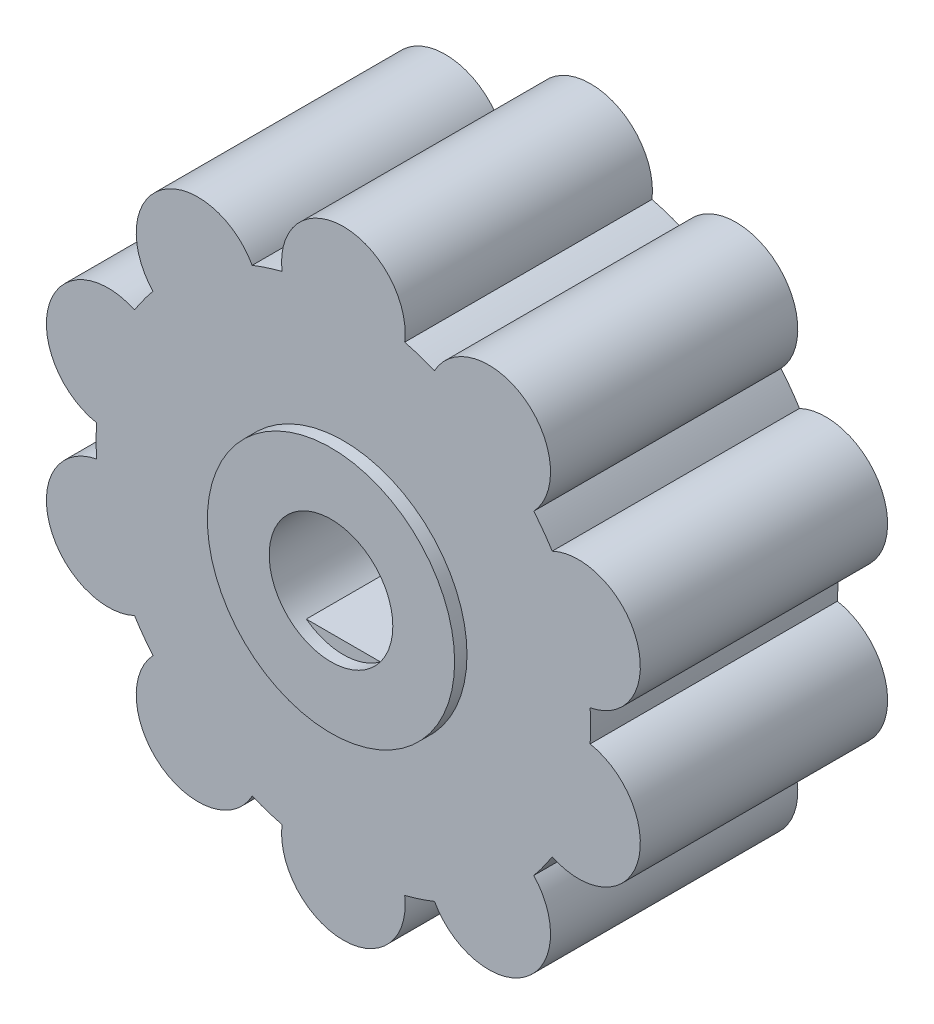
ISO-10303-21;
HEADER;
FILE_DESCRIPTION(('STEP AP214'),'2;1');
FILE_NAME('part.step','',(''),(''),'','','');
FILE_SCHEMA(('AUTOMOTIVE_DESIGN { 1 0 10303 214 1 1 1 1 }'));
ENDSEC;
DATA;
#1=APPLICATION_CONTEXT('core data for automotive mechanical design processes');
#2=APPLICATION_PROTOCOL_DEFINITION('international standard','automotive_design',2000,#1);
#3=PRODUCT_CONTEXT('',#1,'mechanical');
#4=PRODUCT('Part','Part','',(#3));
#5=PRODUCT_RELATED_PRODUCT_CATEGORY('part','',(#4));
#6=PRODUCT_DEFINITION_FORMATION('','',#4);
#7=PRODUCT_DEFINITION_CONTEXT('part definition',#1,'design');
#8=PRODUCT_DEFINITION('design','',#6,#7);
#9=PRODUCT_DEFINITION_SHAPE('','',#8);
#10=(LENGTH_UNIT() NAMED_UNIT(*) SI_UNIT(.MILLI.,.METRE.));
#11=(NAMED_UNIT(*) PLANE_ANGLE_UNIT() SI_UNIT($,.RADIAN.));
#12=(NAMED_UNIT(*) SI_UNIT($,.STERADIAN.) SOLID_ANGLE_UNIT());
#13=UNCERTAINTY_MEASURE_WITH_UNIT(LENGTH_MEASURE(1.E-05),#10,'distance_accuracy_value','');
#14=(GEOMETRIC_REPRESENTATION_CONTEXT(3) GLOBAL_UNCERTAINTY_ASSIGNED_CONTEXT((#13)) GLOBAL_UNIT_ASSIGNED_CONTEXT((#10,
#11,#12)) REPRESENTATION_CONTEXT('',''));
#15=CARTESIAN_POINT('',(0.,0.,0.));
#16=DIRECTION('',(0.,0.,1.));
#17=DIRECTION('',(1.,0.,0.));
#18=AXIS2_PLACEMENT_3D('',#15,#16,#17);
#19=CARTESIAN_POINT('',(0.,0.,10.5));
#20=DIRECTION('',(0.,0.,-1.));
#21=DIRECTION('',(-1.,0.,0.));
#22=AXIS2_PLACEMENT_3D('',#19,#20,#21);
#23=CYLINDRICAL_SURFACE('',#22,2.5);
#24=CARTESIAN_POINT('',(0.,0.,10.5));
#25=DIRECTION('',(0.,0.,1.));
#26=DIRECTION('',(1.,0.,0.));
#27=AXIS2_PLACEMENT_3D('',#24,#25,#26);
#28=CIRCLE('',#27,2.5);
#29=CARTESIAN_POINT('',(2.5,0.,10.5));
#30=VERTEX_POINT('',#29);
#31=EDGE_CURVE('E211',#30,#30,#28,.T.);
#32=ORIENTED_EDGE('',*,*,#31,.T.);
#33=EDGE_LOOP('',(#32));
#34=FACE_BOUND('',#33,.T.);
#35=CARTESIAN_POINT('',(0.,0.,-0.5));
#36=DIRECTION('',(0.,0.,1.));
#37=DIRECTION('',(1.,0.,0.));
#38=AXIS2_PLACEMENT_3D('',#35,#36,#37);
#39=CIRCLE('',#38,2.5);
#40=CARTESIAN_POINT('',(2.5,0.,-0.5));
#41=VERTEX_POINT('',#40);
#42=EDGE_CURVE('E215',#41,#41,#39,.F.);
#43=ORIENTED_EDGE('',*,*,#42,.T.);
#44=EDGE_LOOP('',(#43));
#45=FACE_BOUND('',#44,.T.);
#46=DIRECTION('',(0.,0.,1.));
#47=VECTOR('',#46,1.);
#48=CARTESIAN_POINT('',(-1.5,-2.,0.));
#49=LINE('',#48,#47);
#50=CARTESIAN_POINT('',(-1.5,-2.,0.));
#51=VERTEX_POINT('',#50);
#52=CARTESIAN_POINT('',(-1.5,-2.,10.));
#53=VERTEX_POINT('',#52);
#54=EDGE_CURVE('E64',#51,#53,#49,.T.);
#55=ORIENTED_EDGE('',*,*,#54,.F.);
#56=CARTESIAN_POINT('',(0.,0.,0.));
#57=DIRECTION('',(0.,0.,1.));
#58=DIRECTION('',(1.,0.,0.));
#59=AXIS2_PLACEMENT_3D('',#56,#57,#58);
#60=CIRCLE('',#59,2.5);
#61=CARTESIAN_POINT('',(1.5,-2.,0.));
#62=VERTEX_POINT('',#61);
#63=EDGE_CURVE('E12',#51,#62,#60,.T.);
#64=ORIENTED_EDGE('',*,*,#63,.T.);
#65=DIRECTION('',(0.,0.,-1.));
#66=VECTOR('',#65,1.);
#67=CARTESIAN_POINT('',(1.5,-2.,10.5));
#68=LINE('',#67,#66);
#69=CARTESIAN_POINT('',(1.5,-2.,10.));
#70=VERTEX_POINT('',#69);
#71=EDGE_CURVE('E54',#70,#62,#68,.T.);
#72=ORIENTED_EDGE('',*,*,#71,.F.);
#73=CARTESIAN_POINT('',(0.,0.,10.));
#74=DIRECTION('',(0.,0.,1.));
#75=DIRECTION('',(1.,0.,0.));
#76=AXIS2_PLACEMENT_3D('',#73,#74,#75);
#77=CIRCLE('',#76,2.5);
#78=EDGE_CURVE('E189',#53,#70,#77,.T.);
#79=ORIENTED_EDGE('',*,*,#78,.F.);
#80=EDGE_LOOP('',(#55,#64,#72,#79));
#81=FACE_BOUND('',#80,.T.);
#82=ADVANCED_FACE('F45',(#34,#45,#81),#23,.F.);
#83=CARTESIAN_POINT('',(0.,0.,10.));
#84=DIRECTION('',(0.,0.,-1.));
#85=DIRECTION('',(-1.,0.,0.));
#86=AXIS2_PLACEMENT_3D('',#83,#84,#85);
#87=CYLINDRICAL_SURFACE('',#86,10.);
#88=CARTESIAN_POINT('',(0.,0.,0.));
#89=DIRECTION('',(0.,0.,1.));
#90=DIRECTION('',(1.,0.,0.));
#91=AXIS2_PLACEMENT_3D('',#88,#89,#90);
#92=CIRCLE('',#91,10.);
#93=CARTESIAN_POINT('',(8.44687676597603,5.35259496883655,0.));
#94=VERTEX_POINT('',#93);
#95=CARTESIAN_POINT('',(7.70084879427799,6.37941438124749,0.));
#96=VERTEX_POINT('',#95);
#97=EDGE_CURVE('E398',#94,#96,#92,.T.);
#98=ORIENTED_EDGE('',*,*,#97,.T.);
#99=DIRECTION('',(0.,0.,-1.));
#100=VECTOR('',#99,1.);
#101=CARTESIAN_POINT('',(7.70084879427799,6.37941438124749,5.));
#102=LINE('',#101,#100);
#103=CARTESIAN_POINT('',(7.70084879427799,6.37941438124749,10.));
#104=VERTEX_POINT('',#103);
#105=EDGE_CURVE('E231',#96,#104,#102,.F.);
#106=ORIENTED_EDGE('',*,*,#105,.T.);
#107=CARTESIAN_POINT('',(0.,0.,10.));
#108=DIRECTION('',(0.,0.,1.));
#109=DIRECTION('',(1.,0.,0.));
#110=AXIS2_PLACEMENT_3D('',#107,#108,#109);
#111=CIRCLE('',#110,10.);
#112=CARTESIAN_POINT('',(8.44687676597603,5.35259496883655,10.));
#113=VERTEX_POINT('',#112);
#114=EDGE_CURVE('E473',#113,#104,#111,.T.);
#115=ORIENTED_EDGE('',*,*,#114,.F.);
#116=DIRECTION('',(0.,0.,-1.));
#117=VECTOR('',#116,1.);
#118=CARTESIAN_POINT('',(8.44687676597603,5.35259496883655,5.));
#119=LINE('',#118,#117);
#120=EDGE_CURVE('E239',#113,#94,#119,.T.);
#121=ORIENTED_EDGE('',*,*,#120,.T.);
#122=EDGE_LOOP('',(#98,#106,#115,#121));
#123=FACE_BOUND('',#122,.T.);
#124=ADVANCED_FACE('F492',(#123),#87,.T.);
#125=CARTESIAN_POINT('',(9.97984323724252,-0.634609297178059,0.));
#126=VERTEX_POINT('',#125);
#127=CARTESIAN_POINT('',(9.97984323724251,0.634609297178266,0.));
#128=VERTEX_POINT('',#127);
#129=EDGE_CURVE('E402',#126,#128,#92,.T.);
#130=ORIENTED_EDGE('',*,*,#129,.T.);
#131=DIRECTION('',(0.,0.,-1.));
#132=VECTOR('',#131,1.);
#133=CARTESIAN_POINT('',(9.97984323724251,0.634609297178269,5.));
#134=LINE('',#133,#132);
#135=CARTESIAN_POINT('',(9.97984323724251,0.634609297178266,10.));
#136=VERTEX_POINT('',#135);
#137=EDGE_CURVE('E246',#128,#136,#134,.F.);
#138=ORIENTED_EDGE('',*,*,#137,.T.);
#139=CARTESIAN_POINT('',(9.97984323724252,-0.634609297178057,10.));
#140=VERTEX_POINT('',#139);
#141=EDGE_CURVE('E469',#140,#136,#111,.T.);
#142=ORIENTED_EDGE('',*,*,#141,.F.);
#143=DIRECTION('',(0.,0.,-1.));
#144=VECTOR('',#143,1.);
#145=CARTESIAN_POINT('',(9.97984323724252,-0.634609297178059,5.));
#146=LINE('',#145,#144);
#147=EDGE_CURVE('E254',#140,#126,#146,.T.);
#148=ORIENTED_EDGE('',*,*,#147,.T.);
#149=EDGE_LOOP('',(#130,#138,#142,#148));
#150=FACE_BOUND('',#149,.T.);
#151=ADVANCED_FACE('F499',(#150),#87,.T.);
#152=CARTESIAN_POINT('',(7.70084879427813,-6.37941438124732,0.));
#153=VERTEX_POINT('',#152);
#154=CARTESIAN_POINT('',(8.44687676597614,-5.35259496883637,0.));
#155=VERTEX_POINT('',#154);
#156=EDGE_CURVE('E406',#153,#155,#92,.T.);
#157=ORIENTED_EDGE('',*,*,#156,.T.);
#158=DIRECTION('',(0.,0.,-1.));
#159=VECTOR('',#158,1.);
#160=CARTESIAN_POINT('',(8.44687676597614,-5.35259496883637,5.));
#161=LINE('',#160,#159);
#162=CARTESIAN_POINT('',(8.44687676597614,-5.35259496883637,10.));
#163=VERTEX_POINT('',#162);
#164=EDGE_CURVE('E261',#155,#163,#161,.F.);
#165=ORIENTED_EDGE('',*,*,#164,.T.);
#166=CARTESIAN_POINT('',(7.70084879427813,-6.37941438124732,10.));
#167=VERTEX_POINT('',#166);
#168=EDGE_CURVE('E465',#167,#163,#111,.T.);
#169=ORIENTED_EDGE('',*,*,#168,.F.);
#170=DIRECTION('',(0.,0.,-1.));
#171=VECTOR('',#170,1.);
#172=CARTESIAN_POINT('',(7.70084879427813,-6.37941438124732,5.));
#173=LINE('',#172,#171);
#174=EDGE_CURVE('E269',#167,#153,#173,.T.);
#175=ORIENTED_EDGE('',*,*,#174,.T.);
#176=EDGE_LOOP('',(#157,#165,#169,#175));
#177=FACE_BOUND('',#176,.T.);
#178=ADVANCED_FACE('F502',(#177),#87,.T.);
#179=CARTESIAN_POINT('',(2.48039185412305,-9.6875,0.));
#180=VERTEX_POINT('',#179);
#181=CARTESIAN_POINT('',(3.68749046888868,-9.29528988476719,0.));
#182=VERTEX_POINT('',#181);
#183=EDGE_CURVE('E410',#180,#182,#92,.T.);
#184=ORIENTED_EDGE('',*,*,#183,.T.);
#185=DIRECTION('',(0.,0.,-1.));
#186=VECTOR('',#185,1.);
#187=CARTESIAN_POINT('',(3.68749046888868,-9.29528988476719,5.));
#188=LINE('',#187,#186);
#189=CARTESIAN_POINT('',(3.68749046888868,-9.29528988476719,10.));
#190=VERTEX_POINT('',#189);
#191=EDGE_CURVE('E276',#182,#190,#188,.F.);
#192=ORIENTED_EDGE('',*,*,#191,.T.);
#193=CARTESIAN_POINT('',(2.48039185412306,-9.6875,10.));
#194=VERTEX_POINT('',#193);
#195=EDGE_CURVE('E461',#194,#190,#111,.T.);
#196=ORIENTED_EDGE('',*,*,#195,.F.);
#197=DIRECTION('',(0.,0.,-1.));
#198=VECTOR('',#197,1.);
#199=CARTESIAN_POINT('',(2.48039185412305,-9.6875,5.));
#200=LINE('',#199,#198);
#201=EDGE_CURVE('E284',#194,#180,#200,.T.);
#202=ORIENTED_EDGE('',*,*,#201,.T.);
#203=EDGE_LOOP('',(#184,#192,#196,#202));
#204=FACE_BOUND('',#203,.T.);
#205=ADVANCED_FACE('F509',(#204),#87,.T.);
#206=CARTESIAN_POINT('',(-3.68749046888855,-9.29528988476724,0.));
#207=VERTEX_POINT('',#206);
#208=CARTESIAN_POINT('',(-2.48039185412306,-9.6875,0.));
#209=VERTEX_POINT('',#208);
#210=EDGE_CURVE('E414',#207,#209,#92,.T.);
#211=ORIENTED_EDGE('',*,*,#210,.T.);
#212=DIRECTION('',(0.,0.,-1.));
#213=VECTOR('',#212,1.);
#214=CARTESIAN_POINT('',(-2.48039185412305,-9.6875,5.));
#215=LINE('',#214,#213);
#216=CARTESIAN_POINT('',(-2.48039185412306,-9.6875,10.));
#217=VERTEX_POINT('',#216);
#218=EDGE_CURVE('E291',#209,#217,#215,.F.);
#219=ORIENTED_EDGE('',*,*,#218,.T.);
#220=CARTESIAN_POINT('',(-3.68749046888854,-9.29528988476724,10.));
#221=VERTEX_POINT('',#220);
#222=EDGE_CURVE('E457',#221,#217,#111,.T.);
#223=ORIENTED_EDGE('',*,*,#222,.F.);
#224=DIRECTION('',(0.,0.,-1.));
#225=VECTOR('',#224,1.);
#226=CARTESIAN_POINT('',(-3.68749046888855,-9.29528988476724,5.));
#227=LINE('',#226,#225);
#228=EDGE_CURVE('E299',#221,#207,#227,.T.);
#229=ORIENTED_EDGE('',*,*,#228,.T.);
#230=EDGE_LOOP('',(#211,#219,#223,#229));
#231=FACE_BOUND('',#230,.T.);
#232=ADVANCED_FACE('F512',(#231),#87,.T.);
#233=CARTESIAN_POINT('',(-8.44687676597607,-5.35259496883649,0.));
#234=VERTEX_POINT('',#233);
#235=CARTESIAN_POINT('',(-7.70084879427804,-6.37941438124743,0.));
#236=VERTEX_POINT('',#235);
#237=EDGE_CURVE('E418',#234,#236,#92,.T.);
#238=ORIENTED_EDGE('',*,*,#237,.T.);
#239=DIRECTION('',(0.,0.,-1.));
#240=VECTOR('',#239,1.);
#241=CARTESIAN_POINT('',(-7.70084879427804,-6.37941438124743,5.));
#242=LINE('',#241,#240);
#243=CARTESIAN_POINT('',(-7.70084879427804,-6.37941438124743,10.));
#244=VERTEX_POINT('',#243);
#245=EDGE_CURVE('E306',#236,#244,#242,.F.);
#246=ORIENTED_EDGE('',*,*,#245,.T.);
#247=CARTESIAN_POINT('',(-8.44687676597607,-5.35259496883649,10.));
#248=VERTEX_POINT('',#247);
#249=EDGE_CURVE('E454',#248,#244,#111,.T.);
#250=ORIENTED_EDGE('',*,*,#249,.F.);
#251=DIRECTION('',(0.,0.,-1.));
#252=VECTOR('',#251,1.);
#253=CARTESIAN_POINT('',(-8.44687676597607,-5.35259496883649,5.));
#254=LINE('',#253,#252);
#255=EDGE_CURVE('E314',#248,#234,#254,.T.);
#256=ORIENTED_EDGE('',*,*,#255,.T.);
#257=EDGE_LOOP('',(#238,#246,#250,#256));
#258=FACE_BOUND('',#257,.T.);
#259=ADVANCED_FACE('F518',(#258),#87,.T.);
#260=CARTESIAN_POINT('',(-9.97984323724251,0.634609297178127,0.));
#261=VERTEX_POINT('',#260);
#262=CARTESIAN_POINT('',(-9.97984323724251,-0.634609297178196,0.));
#263=VERTEX_POINT('',#262);
#264=EDGE_CURVE('E422',#261,#263,#92,.T.);
#265=ORIENTED_EDGE('',*,*,#264,.T.);
#266=DIRECTION('',(0.,0.,-1.));
#267=VECTOR('',#266,1.);
#268=CARTESIAN_POINT('',(-9.97984323724251,-0.634609297178199,5.));
#269=LINE('',#268,#267);
#270=CARTESIAN_POINT('',(-9.97984323724251,-0.634609297178196,10.));
#271=VERTEX_POINT('',#270);
#272=EDGE_CURVE('E321',#263,#271,#269,.F.);
#273=ORIENTED_EDGE('',*,*,#272,.T.);
#274=CARTESIAN_POINT('',(-9.97984323724251,0.634609297178124,10.));
#275=VERTEX_POINT('',#274);
#276=EDGE_CURVE('E445',#275,#271,#111,.T.);
#277=ORIENTED_EDGE('',*,*,#276,.F.);
#278=DIRECTION('',(0.,0.,-1.));
#279=VECTOR('',#278,1.);
#280=CARTESIAN_POINT('',(-9.97984323724251,0.634609297178127,5.));
#281=LINE('',#280,#279);
#282=EDGE_CURVE('E329',#275,#261,#281,.T.);
#283=ORIENTED_EDGE('',*,*,#282,.T.);
#284=EDGE_LOOP('',(#265,#273,#277,#283));
#285=FACE_BOUND('',#284,.T.);
#286=ADVANCED_FACE('F443',(#285),#87,.T.);
#287=CARTESIAN_POINT('',(-7.70084879427808,6.37941438124738,0.));
#288=VERTEX_POINT('',#287);
#289=CARTESIAN_POINT('',(-8.44687676597611,5.35259496883643,0.));
#290=VERTEX_POINT('',#289);
#291=EDGE_CURVE('E391',#288,#290,#92,.T.);
#292=ORIENTED_EDGE('',*,*,#291,.T.);
#293=DIRECTION('',(0.,0.,-1.));
#294=VECTOR('',#293,1.);
#295=CARTESIAN_POINT('',(-8.44687676597611,5.35259496883643,5.));
#296=LINE('',#295,#294);
#297=CARTESIAN_POINT('',(-8.44687676597611,5.35259496883643,10.));
#298=VERTEX_POINT('',#297);
#299=EDGE_CURVE('E336',#290,#298,#296,.F.);
#300=ORIENTED_EDGE('',*,*,#299,.T.);
#301=CARTESIAN_POINT('',(-7.70084879427808,6.37941438124738,10.));
#302=VERTEX_POINT('',#301);
#303=EDGE_CURVE('E386',#302,#298,#111,.T.);
#304=ORIENTED_EDGE('',*,*,#303,.F.);
#305=DIRECTION('',(0.,0.,-1.));
#306=VECTOR('',#305,1.);
#307=CARTESIAN_POINT('',(-7.70084879427808,6.37941438124738,5.));
#308=LINE('',#307,#306);
#309=EDGE_CURVE('E344',#302,#288,#308,.T.);
#310=ORIENTED_EDGE('',*,*,#309,.T.);
#311=EDGE_LOOP('',(#292,#300,#304,#310));
#312=FACE_BOUND('',#311,.T.);
#313=ADVANCED_FACE('F431',(#312),#87,.T.);
#314=CARTESIAN_POINT('',(-2.48039185412305,9.6875,0.));
#315=VERTEX_POINT('',#314);
#316=CARTESIAN_POINT('',(-3.68749046888861,9.29528988476721,0.));
#317=VERTEX_POINT('',#316);
#318=EDGE_CURVE('E388',#315,#317,#92,.T.);
#319=ORIENTED_EDGE('',*,*,#318,.T.);
#320=DIRECTION('',(0.,0.,-1.));
#321=VECTOR('',#320,1.);
#322=CARTESIAN_POINT('',(-3.68749046888861,9.29528988476721,5.));
#323=LINE('',#322,#321);
#324=CARTESIAN_POINT('',(-3.68749046888861,9.29528988476721,10.));
#325=VERTEX_POINT('',#324);
#326=EDGE_CURVE('E351',#317,#325,#323,.F.);
#327=ORIENTED_EDGE('',*,*,#326,.T.);
#328=CARTESIAN_POINT('',(-2.48039185412306,9.6875,10.));
#329=VERTEX_POINT('',#328);
#330=EDGE_CURVE('E382',#329,#325,#111,.T.);
#331=ORIENTED_EDGE('',*,*,#330,.F.);
#332=DIRECTION('',(0.,0.,-1.));
#333=VECTOR('',#332,1.);
#334=CARTESIAN_POINT('',(-2.48039185412305,9.6875,5.));
#335=LINE('',#334,#333);
#336=EDGE_CURVE('E359',#329,#315,#335,.T.);
#337=ORIENTED_EDGE('',*,*,#336,.T.);
#338=EDGE_LOOP('',(#319,#327,#331,#337));
#339=FACE_BOUND('',#338,.T.);
#340=ADVANCED_FACE('F485',(#339),#87,.T.);
#341=CARTESIAN_POINT('',(3.68749046888847,9.29528988476727,10.));
#342=VERTEX_POINT('',#341);
#343=CARTESIAN_POINT('',(2.48039185412306,9.6875,10.));
#344=VERTEX_POINT('',#343);
#345=EDGE_CURVE('E387',#342,#344,#111,.T.);
#346=ORIENTED_EDGE('',*,*,#345,.F.);
#347=DIRECTION('',(0.,0.,-1.));
#348=VECTOR('',#347,1.);
#349=CARTESIAN_POINT('',(3.68749046888848,9.29528988476727,5.));
#350=LINE('',#349,#348);
#351=CARTESIAN_POINT('',(3.68749046888848,9.29528988476727,0.));
#352=VERTEX_POINT('',#351);
#353=EDGE_CURVE('E224',#342,#352,#350,.T.);
#354=ORIENTED_EDGE('',*,*,#353,.T.);
#355=CARTESIAN_POINT('',(2.48039185412306,9.6875,0.));
#356=VERTEX_POINT('',#355);
#357=EDGE_CURVE('E392',#352,#356,#92,.T.);
#358=ORIENTED_EDGE('',*,*,#357,.T.);
#359=DIRECTION('',(0.,0.,-1.));
#360=VECTOR('',#359,1.);
#361=CARTESIAN_POINT('',(2.48039185412305,9.6875,5.));
#362=LINE('',#361,#360);
#363=EDGE_CURVE('E366',#356,#344,#362,.F.);
#364=ORIENTED_EDGE('',*,*,#363,.T.);
#365=EDGE_LOOP('',(#346,#354,#358,#364));
#366=FACE_BOUND('',#365,.T.);
#367=ADVANCED_FACE('F47',(#366),#87,.T.);
#368=CARTESIAN_POINT('',(0.,0.,10.));
#369=DIRECTION('',(0.,0.,1.));
#370=DIRECTION('',(1.,0.,0.));
#371=AXIS2_PLACEMENT_3D('',#368,#369,#370);
#372=PLANE('',#371);
#373=ORIENTED_EDGE('',*,*,#114,.T.);
#374=CARTESIAN_POINT('',(5.87785252292463,8.09016994374955,10.));
#375=DIRECTION('',(0.,0.,-1.));
#376=DIRECTION('',(-0.809016994374955,0.587785252292462,0.));
#377=AXIS2_PLACEMENT_3D('',#374,#375,#376);
#378=CIRCLE('',#377,2.5);
#379=EDGE_CURVE('E220',#342,#104,#378,.T.);
#380=ORIENTED_EDGE('',*,*,#379,.F.);
#381=ORIENTED_EDGE('',*,*,#345,.T.);
#382=CARTESIAN_POINT('',(0.,10.,10.));
#383=DIRECTION('',(0.,0.,-1.));
#384=DIRECTION('',(-1.,0.,0.));
#385=AXIS2_PLACEMENT_3D('',#382,#383,#384);
#386=CIRCLE('',#385,2.5);
#387=EDGE_CURVE('E355',#329,#344,#386,.T.);
#388=ORIENTED_EDGE('',*,*,#387,.F.);
#389=ORIENTED_EDGE('',*,*,#330,.T.);
#390=CARTESIAN_POINT('',(-5.87785252292474,8.09016994374947,10.));
#391=DIRECTION('',(0.,0.,-1.));
#392=DIRECTION('',(-0.809016994374947,-0.587785252292474,0.));
#393=AXIS2_PLACEMENT_3D('',#390,#391,#392);
#394=CIRCLE('',#393,2.5);
#395=EDGE_CURVE('E340',#302,#325,#394,.T.);
#396=ORIENTED_EDGE('',*,*,#395,.F.);
#397=ORIENTED_EDGE('',*,*,#303,.T.);
#398=CARTESIAN_POINT('',(-9.51056516295155,3.09016994374945,10.));
#399=DIRECTION('',(0.,0.,-1.));
#400=DIRECTION('',(-0.309016994374945,-0.951056516295155,0.));
#401=AXIS2_PLACEMENT_3D('',#398,#399,#400);
#402=CIRCLE('',#401,2.5);
#403=EDGE_CURVE('E325',#275,#298,#402,.T.);
#404=ORIENTED_EDGE('',*,*,#403,.F.);
#405=ORIENTED_EDGE('',*,*,#276,.T.);
#406=CARTESIAN_POINT('',(-9.51056516295153,-3.09016994374952,10.));
#407=DIRECTION('',(0.,0.,-1.));
#408=DIRECTION('',(0.309016994374952,-0.951056516295152,0.));
#409=AXIS2_PLACEMENT_3D('',#406,#407,#408);
#410=CIRCLE('',#409,2.5);
#411=EDGE_CURVE('E310',#248,#271,#410,.T.);
#412=ORIENTED_EDGE('',*,*,#411,.F.);
#413=ORIENTED_EDGE('',*,*,#249,.T.);
#414=CARTESIAN_POINT('',(-5.87785252292469,-8.09016994374951,10.));
#415=DIRECTION('',(0.,0.,-1.));
#416=DIRECTION('',(0.809016994374951,-0.587785252292469,0.));
#417=AXIS2_PLACEMENT_3D('',#414,#415,#416);
#418=CIRCLE('',#417,2.5);
#419=EDGE_CURVE('E295',#221,#244,#418,.T.);
#420=ORIENTED_EDGE('',*,*,#419,.F.);
#421=ORIENTED_EDGE('',*,*,#222,.T.);
#422=CARTESIAN_POINT('',(0.,-10.,10.));
#423=DIRECTION('',(0.,0.,-1.));
#424=DIRECTION('',(1.,0.,0.));
#425=AXIS2_PLACEMENT_3D('',#422,#423,#424);
#426=CIRCLE('',#425,2.5);
#427=EDGE_CURVE('E280',#194,#217,#426,.T.);
#428=ORIENTED_EDGE('',*,*,#427,.F.);
#429=ORIENTED_EDGE('',*,*,#195,.T.);
#430=CARTESIAN_POINT('',(5.8778525229248,-8.09016994374942,10.));
#431=DIRECTION('',(0.,0.,-1.));
#432=DIRECTION('',(0.809016994374942,0.58778525229248,0.));
#433=AXIS2_PLACEMENT_3D('',#430,#431,#432);
#434=CIRCLE('',#433,2.5);
#435=EDGE_CURVE('E265',#167,#190,#434,.T.);
#436=ORIENTED_EDGE('',*,*,#435,.F.);
#437=ORIENTED_EDGE('',*,*,#168,.T.);
#438=CARTESIAN_POINT('',(9.51056516295157,-3.09016994374938,10.));
#439=DIRECTION('',(0.,0.,-1.));
#440=DIRECTION('',(0.309016994374938,0.951056516295157,0.));
#441=AXIS2_PLACEMENT_3D('',#438,#439,#440);
#442=CIRCLE('',#441,2.5);
#443=EDGE_CURVE('E250',#140,#163,#442,.T.);
#444=ORIENTED_EDGE('',*,*,#443,.F.);
#445=ORIENTED_EDGE('',*,*,#141,.T.);
#446=CARTESIAN_POINT('',(9.5105651629515,3.09016994374958,10.));
#447=DIRECTION('',(0.,0.,-1.));
#448=DIRECTION('',(-0.309016994374958,0.95105651629515,0.));
#449=AXIS2_PLACEMENT_3D('',#446,#447,#448);
#450=CIRCLE('',#449,2.5);
#451=EDGE_CURVE('E235',#113,#136,#450,.T.);
#452=ORIENTED_EDGE('',*,*,#451,.F.);
#453=EDGE_LOOP('',(#373,#380,#381,#388,#389,#396,#397,#404,#405,#412,#413,#420,#421,#428,#429,
#436,#437,#444,#445,#452));
#454=FACE_BOUND('',#453,.T.);
#455=CARTESIAN_POINT('',(0.,0.,10.));
#456=DIRECTION('',(0.,0.,1.));
#457=DIRECTION('',(1.,0.,0.));
#458=AXIS2_PLACEMENT_3D('',#455,#456,#457);
#459=CIRCLE('',#458,5.);
#460=CARTESIAN_POINT('',(5.,0.,10.));
#461=VERTEX_POINT('',#460);
#462=EDGE_CURVE('E200',#461,#461,#459,.T.);
#463=ORIENTED_EDGE('',*,*,#462,.F.);
#464=EDGE_LOOP('',(#463));
#465=FACE_BOUND('',#464,.T.);
#466=ADVANCED_FACE('F448',(#454,#465),#372,.T.);
#467=CARTESIAN_POINT('',(0.,0.,0.));
#468=DIRECTION('',(0.,0.,1.));
#469=DIRECTION('',(1.,0.,0.));
#470=AXIS2_PLACEMENT_3D('',#467,#468,#469);
#471=PLANE('',#470);
#472=CARTESIAN_POINT('',(0.,0.,0.));
#473=DIRECTION('',(0.,0.,1.));
#474=DIRECTION('',(1.,0.,0.));
#475=AXIS2_PLACEMENT_3D('',#472,#473,#474);
#476=CIRCLE('',#475,5.);
#477=CARTESIAN_POINT('',(5.,0.,0.));
#478=VERTEX_POINT('',#477);
#479=EDGE_CURVE('E378',#478,#478,#476,.T.);
#480=ORIENTED_EDGE('',*,*,#479,.T.);
#481=EDGE_LOOP('',(#480));
#482=FACE_BOUND('',#481,.T.);
#483=ORIENTED_EDGE('',*,*,#357,.F.);
#484=CARTESIAN_POINT('',(5.87785252292463,8.09016994374955,0.));
#485=DIRECTION('',(0.,0.,-1.));
#486=DIRECTION('',(-0.809016994374955,0.587785252292462,0.));
#487=AXIS2_PLACEMENT_3D('',#484,#485,#486);
#488=CIRCLE('',#487,2.5);
#489=EDGE_CURVE('E219',#352,#96,#488,.T.);
#490=ORIENTED_EDGE('',*,*,#489,.T.);
#491=ORIENTED_EDGE('',*,*,#97,.F.);
#492=CARTESIAN_POINT('',(9.5105651629515,3.09016994374958,0.));
#493=DIRECTION('',(0.,0.,-1.));
#494=DIRECTION('',(-0.309016994374958,0.95105651629515,0.));
#495=AXIS2_PLACEMENT_3D('',#492,#493,#494);
#496=CIRCLE('',#495,2.5);
#497=EDGE_CURVE('E234',#94,#128,#496,.T.);
#498=ORIENTED_EDGE('',*,*,#497,.T.);
#499=ORIENTED_EDGE('',*,*,#129,.F.);
#500=CARTESIAN_POINT('',(9.51056516295157,-3.09016994374938,0.));
#501=DIRECTION('',(0.,0.,-1.));
#502=DIRECTION('',(0.309016994374938,0.951056516295157,0.));
#503=AXIS2_PLACEMENT_3D('',#500,#501,#502);
#504=CIRCLE('',#503,2.5);
#505=EDGE_CURVE('E249',#126,#155,#504,.T.);
#506=ORIENTED_EDGE('',*,*,#505,.T.);
#507=ORIENTED_EDGE('',*,*,#156,.F.);
#508=CARTESIAN_POINT('',(5.8778525229248,-8.09016994374942,0.));
#509=DIRECTION('',(0.,0.,-1.));
#510=DIRECTION('',(0.809016994374942,0.58778525229248,0.));
#511=AXIS2_PLACEMENT_3D('',#508,#509,#510);
#512=CIRCLE('',#511,2.5);
#513=EDGE_CURVE('E264',#153,#182,#512,.T.);
#514=ORIENTED_EDGE('',*,*,#513,.T.);
#515=ORIENTED_EDGE('',*,*,#183,.F.);
#516=CARTESIAN_POINT('',(0.,-10.,0.));
#517=DIRECTION('',(0.,0.,-1.));
#518=DIRECTION('',(1.,0.,0.));
#519=AXIS2_PLACEMENT_3D('',#516,#517,#518);
#520=CIRCLE('',#519,2.5);
#521=EDGE_CURVE('E279',#180,#209,#520,.T.);
#522=ORIENTED_EDGE('',*,*,#521,.T.);
#523=ORIENTED_EDGE('',*,*,#210,.F.);
#524=CARTESIAN_POINT('',(-5.87785252292469,-8.09016994374951,0.));
#525=DIRECTION('',(0.,0.,-1.));
#526=DIRECTION('',(0.809016994374951,-0.587785252292469,0.));
#527=AXIS2_PLACEMENT_3D('',#524,#525,#526);
#528=CIRCLE('',#527,2.5);
#529=EDGE_CURVE('E294',#207,#236,#528,.T.);
#530=ORIENTED_EDGE('',*,*,#529,.T.);
#531=ORIENTED_EDGE('',*,*,#237,.F.);
#532=CARTESIAN_POINT('',(-9.51056516295153,-3.09016994374952,0.));
#533=DIRECTION('',(0.,0.,-1.));
#534=DIRECTION('',(0.309016994374952,-0.951056516295152,0.));
#535=AXIS2_PLACEMENT_3D('',#532,#533,#534);
#536=CIRCLE('',#535,2.5);
#537=EDGE_CURVE('E309',#234,#263,#536,.T.);
#538=ORIENTED_EDGE('',*,*,#537,.T.);
#539=ORIENTED_EDGE('',*,*,#264,.F.);
#540=CARTESIAN_POINT('',(-9.51056516295155,3.09016994374945,0.));
#541=DIRECTION('',(0.,0.,-1.));
#542=DIRECTION('',(-0.309016994374945,-0.951056516295155,0.));
#543=AXIS2_PLACEMENT_3D('',#540,#541,#542);
#544=CIRCLE('',#543,2.5);
#545=EDGE_CURVE('E324',#261,#290,#544,.T.);
#546=ORIENTED_EDGE('',*,*,#545,.T.);
#547=ORIENTED_EDGE('',*,*,#291,.F.);
#548=CARTESIAN_POINT('',(-5.87785252292474,8.09016994374947,0.));
#549=DIRECTION('',(0.,0.,-1.));
#550=DIRECTION('',(-0.809016994374947,-0.587785252292474,0.));
#551=AXIS2_PLACEMENT_3D('',#548,#549,#550);
#552=CIRCLE('',#551,2.5);
#553=EDGE_CURVE('E339',#288,#317,#552,.T.);
#554=ORIENTED_EDGE('',*,*,#553,.T.);
#555=ORIENTED_EDGE('',*,*,#318,.F.);
#556=CARTESIAN_POINT('',(0.,10.,0.));
#557=DIRECTION('',(0.,0.,-1.));
#558=DIRECTION('',(-1.,0.,0.));
#559=AXIS2_PLACEMENT_3D('',#556,#557,#558);
#560=CIRCLE('',#559,2.5);
#561=EDGE_CURVE('E354',#315,#356,#560,.T.);
#562=ORIENTED_EDGE('',*,*,#561,.T.);
#563=EDGE_LOOP('',(#483,#490,#491,#498,#499,#506,#507,#514,#515,#522,#523,#530,#531,#538,#539,
#546,#547,#554,#555,#562));
#564=FACE_BOUND('',#563,.T.);
#565=ADVANCED_FACE('F441',(#482,#564),#471,.F.);
#566=CARTESIAN_POINT('',(0.,0.,-0.5));
#567=DIRECTION('',(0.,0.,1.));
#568=DIRECTION('',(1.,0.,0.));
#569=AXIS2_PLACEMENT_3D('',#566,#567,#568);
#570=PLANE('',#569);
#571=ORIENTED_EDGE('',*,*,#42,.F.);
#572=EDGE_LOOP('',(#571));
#573=FACE_BOUND('',#572,.T.);
#574=CARTESIAN_POINT('',(0.,0.,-0.5));
#575=DIRECTION('',(0.,0.,1.));
#576=DIRECTION('',(1.,0.,0.));
#577=AXIS2_PLACEMENT_3D('',#574,#575,#576);
#578=CIRCLE('',#577,5.);
#579=CARTESIAN_POINT('',(5.,0.,-0.500000000000001));
#580=VERTEX_POINT('',#579);
#581=EDGE_CURVE('E374',#580,#580,#578,.T.);
#582=ORIENTED_EDGE('',*,*,#581,.F.);
#583=EDGE_LOOP('',(#582));
#584=FACE_BOUND('',#583,.T.);
#585=ADVANCED_FACE('F661',(#573,#584),#570,.F.);
#586=CARTESIAN_POINT('',(0.,0.,-0.5));
#587=DIRECTION('',(0.,0.,1.));
#588=DIRECTION('',(1.,0.,0.));
#589=AXIS2_PLACEMENT_3D('',#586,#587,#588);
#590=CYLINDRICAL_SURFACE('',#589,5.);
#591=CARTESIAN_POINT('',(5.,0.,-0.500000000000001));
#592=CARTESIAN_POINT('',(5.,0.,-0.494791666666667));
#593=CARTESIAN_POINT('',(5.,0.,-0.489583333333334));
#594=CARTESIAN_POINT('',(5.,0.,-0.479166666666667));
#595=CARTESIAN_POINT('',(5.,0.,-0.473958333333334));
#596=CARTESIAN_POINT('',(5.,0.,-0.463541666666667));
#597=CARTESIAN_POINT('',(5.,0.,-0.458333333333334));
#598=CARTESIAN_POINT('',(5.,0.,-0.447916666666667));
#599=CARTESIAN_POINT('',(5.,0.,-0.442708333333334));
#600=CARTESIAN_POINT('',(5.,0.,-0.432291666666667));
#601=CARTESIAN_POINT('',(5.,0.,-0.427083333333334));
#602=CARTESIAN_POINT('',(5.,0.,-0.416666666666667));
#603=CARTESIAN_POINT('',(5.,0.,-0.411458333333334));
#604=CARTESIAN_POINT('',(5.,0.,-0.401041666666667));
#605=CARTESIAN_POINT('',(5.,0.,-0.395833333333334));
#606=CARTESIAN_POINT('',(5.,0.,-0.385416666666667));
#607=CARTESIAN_POINT('',(5.,0.,-0.380208333333334));
#608=CARTESIAN_POINT('',(5.,0.,-0.369791666666667));
#609=CARTESIAN_POINT('',(5.,0.,-0.364583333333334));
#610=CARTESIAN_POINT('',(5.,0.,-0.354166666666667));
#611=CARTESIAN_POINT('',(5.,0.,-0.348958333333334));
#612=CARTESIAN_POINT('',(5.,0.,-0.338541666666667));
#613=CARTESIAN_POINT('',(5.,0.,-0.333333333333334));
#614=CARTESIAN_POINT('',(5.,0.,-0.322916666666667));
#615=CARTESIAN_POINT('',(5.,0.,-0.317708333333334));
#616=CARTESIAN_POINT('',(5.,0.,-0.307291666666667));
#617=CARTESIAN_POINT('',(5.,0.,-0.302083333333334));
#618=CARTESIAN_POINT('',(5.,0.,-0.291666666666667));
#619=CARTESIAN_POINT('',(5.,0.,-0.286458333333334));
#620=CARTESIAN_POINT('',(5.,0.,-0.276041666666667));
#621=CARTESIAN_POINT('',(5.,0.,-0.270833333333334));
#622=CARTESIAN_POINT('',(5.,0.,-0.260416666666667));
#623=CARTESIAN_POINT('',(5.,0.,-0.255208333333334));
#624=CARTESIAN_POINT('',(5.,0.,-0.244791666666667));
#625=CARTESIAN_POINT('',(5.,0.,-0.239583333333334));
#626=CARTESIAN_POINT('',(5.,0.,-0.229166666666667));
#627=CARTESIAN_POINT('',(5.,0.,-0.223958333333334));
#628=CARTESIAN_POINT('',(5.,0.,-0.213541666666667));
#629=CARTESIAN_POINT('',(5.,0.,-0.208333333333334));
#630=CARTESIAN_POINT('',(5.,0.,-0.197916666666667));
#631=CARTESIAN_POINT('',(5.,0.,-0.192708333333334));
#632=CARTESIAN_POINT('',(5.,0.,-0.182291666666667));
#633=CARTESIAN_POINT('',(5.,0.,-0.177083333333334));
#634=CARTESIAN_POINT('',(5.,0.,-0.166666666666667));
#635=CARTESIAN_POINT('',(5.,0.,-0.161458333333334));
#636=CARTESIAN_POINT('',(5.,0.,-0.151041666666667));
#637=CARTESIAN_POINT('',(5.,0.,-0.145833333333334));
#638=CARTESIAN_POINT('',(5.,0.,-0.135416666666667));
#639=CARTESIAN_POINT('',(5.,0.,-0.130208333333333));
#640=CARTESIAN_POINT('',(5.,0.,-0.119791666666667));
#641=CARTESIAN_POINT('',(5.,0.,-0.114583333333333));
#642=CARTESIAN_POINT('',(5.,0.,-0.104166666666667));
#643=CARTESIAN_POINT('',(5.,0.,-0.0989583333333334));
#644=CARTESIAN_POINT('',(5.,0.,-0.0885416666666667));
#645=CARTESIAN_POINT('',(5.,0.,-0.0833333333333334));
#646=CARTESIAN_POINT('',(5.,0.,-0.0729166666666667));
#647=CARTESIAN_POINT('',(5.,0.,-0.0677083333333334));
#648=CARTESIAN_POINT('',(5.,0.,-0.0572916666666667));
#649=CARTESIAN_POINT('',(5.,0.,-0.0520833333333334));
#650=CARTESIAN_POINT('',(5.,0.,-0.0416666666666667));
#651=CARTESIAN_POINT('',(5.,0.,-0.0364583333333334));
#652=CARTESIAN_POINT('',(5.,0.,-0.0260416666666667));
#653=CARTESIAN_POINT('',(5.,0.,-0.0208333333333333));
#654=CARTESIAN_POINT('',(5.,0.,-0.0104166666666667));
#655=CARTESIAN_POINT('',(5.,0.,-0.00520833333333341));
#656=CARTESIAN_POINT('',(5.,0.,0.));
#657=B_SPLINE_CURVE_WITH_KNOTS('',3,(#591,#592,#593,#594,#595,#596,#597,#598,#599,#600,#601,
#602,#603,#604,#605,#606,#607,#608,#609,#610,#611,#612,#613,#614,#615,#616,#617,#618,#619,#620,
#621,#622,#623,#624,#625,#626,#627,#628,#629,#630,#631,#632,#633,#634,#635,#636,#637,#638,#639,
#640,#641,#642,#643,#644,#645,#646,#647,#648,#649,#650,#651,#652,#653,#654,#655,#656),
.UNSPECIFIED.,.F.,.F.,(4,2,2,2,2,2,2,2,2,2,2,2,2,2,2,2,2,2,2,2,2,2,2,2,2,2,2,2,2,2,2,2,4),(0.,
0.0156250000000001,0.0312500000000001,0.0468750000000001,0.0625000000000001,0.0781250000000001,
0.0937500000000001,0.109375,0.125,0.140625,0.15625,0.171875,0.1875,0.203125,0.21875,0.234375,
0.25,0.265625,0.28125,0.296875,0.3125,0.328125,0.34375,0.359375,0.375,0.390625,0.40625,0.421875,
0.4375,0.453125,0.46875,0.484375000000001,0.5),.UNSPECIFIED.);
#658=EDGE_CURVE('BSEAM766',#580,#478,#657,.T.);
#659=ORIENTED_EDGE('',*,*,#581,.T.);
#660=ORIENTED_EDGE('',*,*,#479,.F.);
#661=ORIENTED_EDGE('',*,*,#658,.T.);
#662=ORIENTED_EDGE('',*,*,#658,.F.);
#663=EDGE_LOOP('',(#659,#661,#660,#662));
#664=FACE_BOUND('',#663,.T.);
#665=ADVANCED_FACE('F766',(#664),#590,.T.);
#666=CARTESIAN_POINT('',(0.,0.,10.5));
#667=DIRECTION('',(0.,0.,1.));
#668=DIRECTION('',(1.,0.,0.));
#669=AXIS2_PLACEMENT_3D('',#666,#667,#668);
#670=CIRCLE('',#669,5.);
#671=CARTESIAN_POINT('',(5.,0.,10.5));
#672=VERTEX_POINT('',#671);
#673=EDGE_CURVE('E370',#672,#672,#670,.T.);
#674=CARTESIAN_POINT('',(5.,0.,10.));
#675=CARTESIAN_POINT('',(5.,0.,10.0052083333333));
#676=CARTESIAN_POINT('',(5.,0.,10.0104166666667));
#677=CARTESIAN_POINT('',(5.,0.,10.0208333333333));
#678=CARTESIAN_POINT('',(5.,0.,10.0260416666667));
#679=CARTESIAN_POINT('',(5.,0.,10.0364583333333));
#680=CARTESIAN_POINT('',(5.,0.,10.0416666666667));
#681=CARTESIAN_POINT('',(5.,0.,10.0520833333333));
#682=CARTESIAN_POINT('',(5.,0.,10.0572916666667));
#683=CARTESIAN_POINT('',(5.,0.,10.0677083333333));
#684=CARTESIAN_POINT('',(5.,0.,10.0729166666667));
#685=CARTESIAN_POINT('',(5.,0.,10.0833333333333));
#686=CARTESIAN_POINT('',(5.,0.,10.0885416666667));
#687=CARTESIAN_POINT('',(5.,0.,10.0989583333333));
#688=CARTESIAN_POINT('',(5.,0.,10.1041666666667));
#689=CARTESIAN_POINT('',(5.,0.,10.1145833333333));
#690=CARTESIAN_POINT('',(5.,0.,10.1197916666667));
#691=CARTESIAN_POINT('',(5.,0.,10.1302083333333));
#692=CARTESIAN_POINT('',(5.,0.,10.1354166666667));
#693=CARTESIAN_POINT('',(5.,0.,10.1458333333333));
#694=CARTESIAN_POINT('',(5.,0.,10.1510416666667));
#695=CARTESIAN_POINT('',(5.,0.,10.1614583333333));
#696=CARTESIAN_POINT('',(5.,0.,10.1666666666667));
#697=CARTESIAN_POINT('',(5.,0.,10.1770833333333));
#698=CARTESIAN_POINT('',(5.,0.,10.1822916666667));
#699=CARTESIAN_POINT('',(5.,0.,10.1927083333333));
#700=CARTESIAN_POINT('',(5.,0.,10.1979166666667));
#701=CARTESIAN_POINT('',(5.,0.,10.2083333333333));
#702=CARTESIAN_POINT('',(5.,0.,10.2135416666667));
#703=CARTESIAN_POINT('',(5.,0.,10.2239583333333));
#704=CARTESIAN_POINT('',(5.,0.,10.2291666666667));
#705=CARTESIAN_POINT('',(5.,0.,10.2395833333333));
#706=CARTESIAN_POINT('',(5.,0.,10.2447916666667));
#707=CARTESIAN_POINT('',(5.,0.,10.2552083333333));
#708=CARTESIAN_POINT('',(5.,0.,10.2604166666667));
#709=CARTESIAN_POINT('',(5.,0.,10.2708333333333));
#710=CARTESIAN_POINT('',(5.,0.,10.2760416666667));
#711=CARTESIAN_POINT('',(5.,0.,10.2864583333333));
#712=CARTESIAN_POINT('',(5.,0.,10.2916666666667));
#713=CARTESIAN_POINT('',(5.,0.,10.3020833333333));
#714=CARTESIAN_POINT('',(5.,0.,10.3072916666667));
#715=CARTESIAN_POINT('',(5.,0.,10.3177083333333));
#716=CARTESIAN_POINT('',(5.,0.,10.3229166666667));
#717=CARTESIAN_POINT('',(5.,0.,10.3333333333333));
#718=CARTESIAN_POINT('',(5.,0.,10.3385416666667));
#719=CARTESIAN_POINT('',(5.,0.,10.3489583333333));
#720=CARTESIAN_POINT('',(5.,0.,10.3541666666667));
#721=CARTESIAN_POINT('',(5.,0.,10.3645833333333));
#722=CARTESIAN_POINT('',(5.,0.,10.3697916666667));
#723=CARTESIAN_POINT('',(5.,0.,10.3802083333333));
#724=CARTESIAN_POINT('',(5.,0.,10.3854166666667));
#725=CARTESIAN_POINT('',(5.,0.,10.3958333333333));
#726=CARTESIAN_POINT('',(5.,0.,10.4010416666667));
#727=CARTESIAN_POINT('',(5.,0.,10.4114583333333));
#728=CARTESIAN_POINT('',(5.,0.,10.4166666666667));
#729=CARTESIAN_POINT('',(5.,0.,10.4270833333333));
#730=CARTESIAN_POINT('',(5.,0.,10.4322916666667));
#731=CARTESIAN_POINT('',(5.,0.,10.4427083333333));
#732=CARTESIAN_POINT('',(5.,0.,10.4479166666667));
#733=CARTESIAN_POINT('',(5.,0.,10.4583333333333));
#734=CARTESIAN_POINT('',(5.,0.,10.4635416666667));
#735=CARTESIAN_POINT('',(5.,0.,10.4739583333333));
#736=CARTESIAN_POINT('',(5.,0.,10.4791666666667));
#737=CARTESIAN_POINT('',(5.,0.,10.4895833333333));
#738=CARTESIAN_POINT('',(5.,0.,10.4947916666667));
#739=CARTESIAN_POINT('',(5.,0.,10.5));
#740=B_SPLINE_CURVE_WITH_KNOTS('',3,(#674,#675,#676,#677,#678,#679,#680,#681,#682,#683,#684,
#685,#686,#687,#688,#689,#690,#691,#692,#693,#694,#695,#696,#697,#698,#699,#700,#701,#702,#703,
#704,#705,#706,#707,#708,#709,#710,#711,#712,#713,#714,#715,#716,#717,#718,#719,#720,#721,#722,
#723,#724,#725,#726,#727,#728,#729,#730,#731,#732,#733,#734,#735,#736,#737,#738,#739),
.UNSPECIFIED.,.F.,.F.,(4,2,2,2,2,2,2,2,2,2,2,2,2,2,2,2,2,2,2,2,2,2,2,2,2,2,2,2,2,2,2,2,4),(0.,
0.015625,0.03125,0.046875,0.0625000000000001,0.0781250000000001,0.0937500000000001,0.109375,
0.125,0.140625,0.15625,0.171875,0.1875,0.203125,0.21875,0.234375,0.25,0.265625,0.28125,0.296875,
0.3125,0.328125,0.34375,0.359375,0.375,0.390625,0.40625,0.421875,0.4375,0.453125,0.46875,
0.484375,0.5),.UNSPECIFIED.);
#741=EDGE_CURVE('BSEAM761',#461,#672,#740,.T.);
#742=ORIENTED_EDGE('',*,*,#462,.T.);
#743=ORIENTED_EDGE('',*,*,#673,.F.);
#744=ORIENTED_EDGE('',*,*,#741,.T.);
#745=ORIENTED_EDGE('',*,*,#741,.F.);
#746=EDGE_LOOP('',(#742,#744,#743,#745));
#747=FACE_BOUND('',#746,.T.);
#748=ADVANCED_FACE('F761',(#747),#590,.T.);
#749=CARTESIAN_POINT('',(0.,0.,10.5));
#750=DIRECTION('',(0.,0.,1.));
#751=DIRECTION('',(1.,0.,0.));
#752=AXIS2_PLACEMENT_3D('',#749,#750,#751);
#753=PLANE('',#752);
#754=ORIENTED_EDGE('',*,*,#31,.F.);
#755=EDGE_LOOP('',(#754));
#756=FACE_BOUND('',#755,.T.);
#757=ORIENTED_EDGE('',*,*,#673,.T.);
#758=EDGE_LOOP('',(#757));
#759=FACE_BOUND('',#758,.T.);
#760=ADVANCED_FACE('F754',(#756,#759),#753,.T.);
#761=CARTESIAN_POINT('',(0.,10.,10.));
#762=DIRECTION('',(0.,0.,-1.));
#763=DIRECTION('',(-1.,0.,0.));
#764=AXIS2_PLACEMENT_3D('',#761,#762,#763);
#765=CYLINDRICAL_SURFACE('',#764,2.5);
#766=ORIENTED_EDGE('',*,*,#363,.F.);
#767=ORIENTED_EDGE('',*,*,#561,.F.);
#768=ORIENTED_EDGE('',*,*,#336,.F.);
#769=ORIENTED_EDGE('',*,*,#387,.T.);
#770=EDGE_LOOP('',(#766,#767,#768,#769));
#771=FACE_BOUND('',#770,.T.);
#772=ADVANCED_FACE('F483',(#771),#765,.T.);
#773=CARTESIAN_POINT('',(-5.87785252292474,8.09016994374947,10.));
#774=DIRECTION('',(0.,0.,-1.));
#775=DIRECTION('',(-1.,0.,0.));
#776=AXIS2_PLACEMENT_3D('',#773,#774,#775);
#777=CYLINDRICAL_SURFACE('',#776,2.5);
#778=ORIENTED_EDGE('',*,*,#326,.F.);
#779=ORIENTED_EDGE('',*,*,#553,.F.);
#780=ORIENTED_EDGE('',*,*,#309,.F.);
#781=ORIENTED_EDGE('',*,*,#395,.T.);
#782=EDGE_LOOP('',(#778,#779,#780,#781));
#783=FACE_BOUND('',#782,.T.);
#784=ADVANCED_FACE('F488',(#783),#777,.T.);
#785=CARTESIAN_POINT('',(-9.51056516295155,3.09016994374945,10.));
#786=DIRECTION('',(0.,0.,-1.));
#787=DIRECTION('',(-1.,0.,0.));
#788=AXIS2_PLACEMENT_3D('',#785,#786,#787);
#789=CYLINDRICAL_SURFACE('',#788,2.5);
#790=ORIENTED_EDGE('',*,*,#299,.F.);
#791=ORIENTED_EDGE('',*,*,#545,.F.);
#792=ORIENTED_EDGE('',*,*,#282,.F.);
#793=ORIENTED_EDGE('',*,*,#403,.T.);
#794=EDGE_LOOP('',(#790,#791,#792,#793));
#795=FACE_BOUND('',#794,.T.);
#796=ADVANCED_FACE('F438',(#795),#789,.T.);
#797=CARTESIAN_POINT('',(-9.51056516295153,-3.09016994374952,10.));
#798=DIRECTION('',(0.,0.,-1.));
#799=DIRECTION('',(-1.,0.,0.));
#800=AXIS2_PLACEMENT_3D('',#797,#798,#799);
#801=CYLINDRICAL_SURFACE('',#800,2.5);
#802=ORIENTED_EDGE('',*,*,#272,.F.);
#803=ORIENTED_EDGE('',*,*,#537,.F.);
#804=ORIENTED_EDGE('',*,*,#255,.F.);
#805=ORIENTED_EDGE('',*,*,#411,.T.);
#806=EDGE_LOOP('',(#802,#803,#804,#805));
#807=FACE_BOUND('',#806,.T.);
#808=ADVANCED_FACE('F520',(#807),#801,.T.);
#809=CARTESIAN_POINT('',(-5.87785252292469,-8.09016994374951,10.));
#810=DIRECTION('',(0.,0.,-1.));
#811=DIRECTION('',(-1.,0.,0.));
#812=AXIS2_PLACEMENT_3D('',#809,#810,#811);
#813=CYLINDRICAL_SURFACE('',#812,2.5);
#814=ORIENTED_EDGE('',*,*,#245,.F.);
#815=ORIENTED_EDGE('',*,*,#529,.F.);
#816=ORIENTED_EDGE('',*,*,#228,.F.);
#817=ORIENTED_EDGE('',*,*,#419,.T.);
#818=EDGE_LOOP('',(#814,#815,#816,#817));
#819=FACE_BOUND('',#818,.T.);
#820=ADVANCED_FACE('F516',(#819),#813,.T.);
#821=CARTESIAN_POINT('',(0.,-10.,10.));
#822=DIRECTION('',(0.,0.,-1.));
#823=DIRECTION('',(-1.,0.,0.));
#824=AXIS2_PLACEMENT_3D('',#821,#822,#823);
#825=CYLINDRICAL_SURFACE('',#824,2.5);
#826=ORIENTED_EDGE('',*,*,#218,.F.);
#827=ORIENTED_EDGE('',*,*,#521,.F.);
#828=ORIENTED_EDGE('',*,*,#201,.F.);
#829=ORIENTED_EDGE('',*,*,#427,.T.);
#830=EDGE_LOOP('',(#826,#827,#828,#829));
#831=FACE_BOUND('',#830,.T.);
#832=ADVANCED_FACE('F511',(#831),#825,.T.);
#833=CARTESIAN_POINT('',(5.8778525229248,-8.09016994374942,10.));
#834=DIRECTION('',(0.,0.,-1.));
#835=DIRECTION('',(-1.,0.,0.));
#836=AXIS2_PLACEMENT_3D('',#833,#834,#835);
#837=CYLINDRICAL_SURFACE('',#836,2.5);
#838=ORIENTED_EDGE('',*,*,#191,.F.);
#839=ORIENTED_EDGE('',*,*,#513,.F.);
#840=ORIENTED_EDGE('',*,*,#174,.F.);
#841=ORIENTED_EDGE('',*,*,#435,.T.);
#842=EDGE_LOOP('',(#838,#839,#840,#841));
#843=FACE_BOUND('',#842,.T.);
#844=ADVANCED_FACE('F506',(#843),#837,.T.);
#845=CARTESIAN_POINT('',(9.51056516295157,-3.09016994374938,10.));
#846=DIRECTION('',(0.,0.,-1.));
#847=DIRECTION('',(-1.,0.,0.));
#848=AXIS2_PLACEMENT_3D('',#845,#846,#847);
#849=CYLINDRICAL_SURFACE('',#848,2.5);
#850=ORIENTED_EDGE('',*,*,#164,.F.);
#851=ORIENTED_EDGE('',*,*,#505,.F.);
#852=ORIENTED_EDGE('',*,*,#147,.F.);
#853=ORIENTED_EDGE('',*,*,#443,.T.);
#854=EDGE_LOOP('',(#850,#851,#852,#853));
#855=FACE_BOUND('',#854,.T.);
#856=ADVANCED_FACE('F501',(#855),#849,.T.);
#857=CARTESIAN_POINT('',(9.5105651629515,3.09016994374958,10.));
#858=DIRECTION('',(0.,0.,-1.));
#859=DIRECTION('',(-1.,0.,0.));
#860=AXIS2_PLACEMENT_3D('',#857,#858,#859);
#861=CYLINDRICAL_SURFACE('',#860,2.5);
#862=ORIENTED_EDGE('',*,*,#137,.F.);
#863=ORIENTED_EDGE('',*,*,#497,.F.);
#864=ORIENTED_EDGE('',*,*,#120,.F.);
#865=ORIENTED_EDGE('',*,*,#451,.T.);
#866=EDGE_LOOP('',(#862,#863,#864,#865));
#867=FACE_BOUND('',#866,.T.);
#868=ADVANCED_FACE('F496',(#867),#861,.T.);
#869=CARTESIAN_POINT('',(5.87785252292463,8.09016994374955,10.));
#870=DIRECTION('',(0.,0.,-1.));
#871=DIRECTION('',(-1.,0.,0.));
#872=AXIS2_PLACEMENT_3D('',#869,#870,#871);
#873=CYLINDRICAL_SURFACE('',#872,2.5);
#874=ORIENTED_EDGE('',*,*,#105,.F.);
#875=ORIENTED_EDGE('',*,*,#489,.F.);
#876=ORIENTED_EDGE('',*,*,#353,.F.);
#877=ORIENTED_EDGE('',*,*,#379,.T.);
#878=EDGE_LOOP('',(#874,#875,#876,#877));
#879=FACE_BOUND('',#878,.T.);
#880=ADVANCED_FACE('F491',(#879),#873,.T.);
#881=CARTESIAN_POINT('',(0.,0.,0.));
#882=DIRECTION('',(0.,0.,1.));
#883=DIRECTION('',(1.,0.,0.));
#884=AXIS2_PLACEMENT_3D('',#881,#882,#883);
#885=PLANE('',#884);
#886=ORIENTED_EDGE('',*,*,#63,.F.);
#887=DIRECTION('',(-1.,0.,0.));
#888=VECTOR('',#887,1.);
#889=CARTESIAN_POINT('',(-1.5,-2.,0.));
#890=LINE('',#889,#888);
#891=EDGE_CURVE('E204',#62,#51,#890,.T.);
#892=ORIENTED_EDGE('',*,*,#891,.F.);
#893=EDGE_LOOP('',(#886,#892));
#894=FACE_BOUND('',#893,.T.);
#895=ADVANCED_FACE('F541',(#894),#885,.F.);
#896=CARTESIAN_POINT('',(0.,0.,10.));
#897=DIRECTION('',(0.,0.,1.));
#898=DIRECTION('',(1.,0.,0.));
#899=AXIS2_PLACEMENT_3D('',#896,#897,#898);
#900=PLANE('',#899);
#901=DIRECTION('',(-1.,0.,0.));
#902=VECTOR('',#901,1.);
#903=CARTESIAN_POINT('',(-1.5,-2.,10.));
#904=LINE('',#903,#902);
#905=EDGE_CURVE('E198',#70,#53,#904,.T.);
#906=ORIENTED_EDGE('',*,*,#905,.T.);
#907=ORIENTED_EDGE('',*,*,#78,.T.);
#908=EDGE_LOOP('',(#906,#907));
#909=FACE_BOUND('',#908,.T.);
#910=ADVANCED_FACE('F197',(#909),#900,.T.);
#911=CARTESIAN_POINT('',(-1.5,-2.,0.));
#912=DIRECTION('',(0.,1.,0.));
#913=DIRECTION('',(0.,0.,1.));
#914=AXIS2_PLACEMENT_3D('',#911,#912,#913);
#915=PLANE('',#914);
#916=ORIENTED_EDGE('',*,*,#905,.F.);
#917=ORIENTED_EDGE('',*,*,#71,.T.);
#918=ORIENTED_EDGE('',*,*,#891,.T.);
#919=ORIENTED_EDGE('',*,*,#54,.T.);
#920=EDGE_LOOP('',(#916,#917,#918,#919));
#921=FACE_BOUND('',#920,.T.);
#922=ADVANCED_FACE('F202',(#921),#915,.T.);
#923=CLOSED_SHELL('',(#82,#124,#151,#178,#205,#232,#259,#286,#313,#340,#367,#466,#565,#585,#665,
#748,#760,#772,#784,#796,#808,#820,#832,#844,#856,#868,#880,#895,#910,#922));
#924=MANIFOLD_SOLID_BREP('B2',#923);
#925=ADVANCED_BREP_SHAPE_REPRESENTATION('',(#18,#924),#14);
#926=SHAPE_DEFINITION_REPRESENTATION(#9,#925);
ENDSEC;
END-ISO-10303-21;
